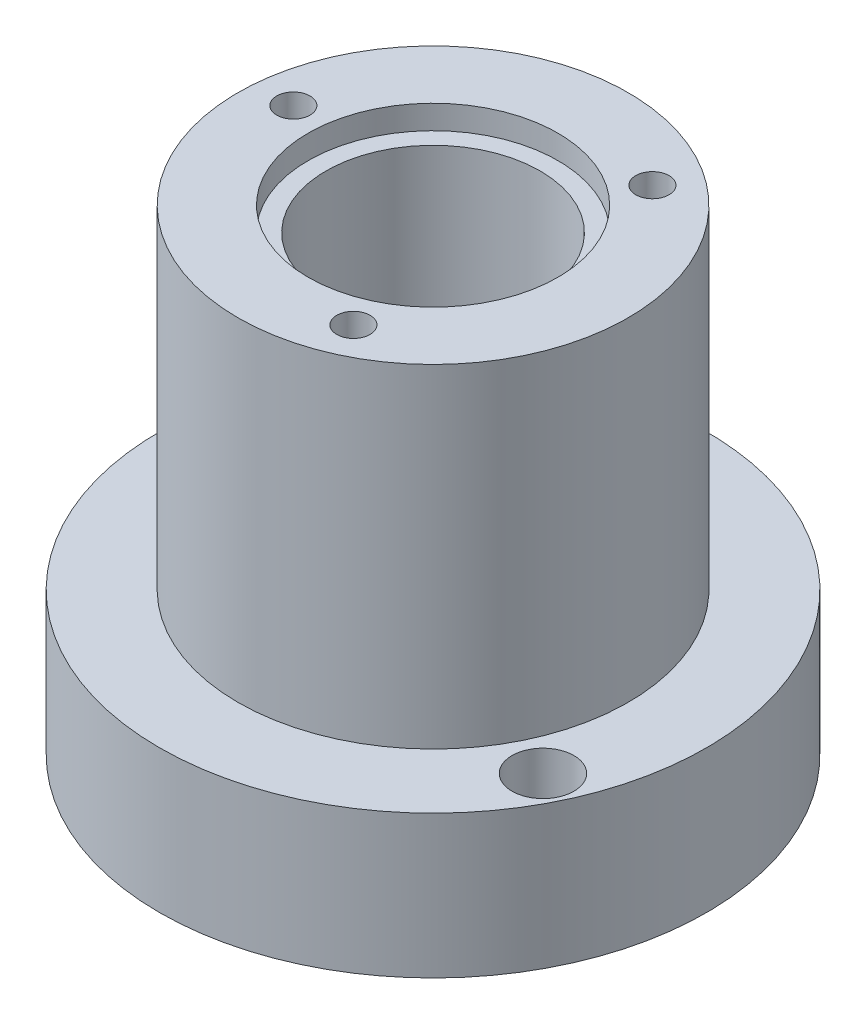
ISO-10303-21;
HEADER;
FILE_DESCRIPTION(('STEP AP214'),'2;1');
FILE_NAME('part.step','',(''),(''),'','','');
FILE_SCHEMA(('AUTOMOTIVE_DESIGN { 1 0 10303 214 1 1 1 1 }'));
ENDSEC;
DATA;
#1=APPLICATION_CONTEXT('core data for automotive mechanical design processes');
#2=APPLICATION_PROTOCOL_DEFINITION('international standard','automotive_design',2000,#1);
#3=PRODUCT_CONTEXT('',#1,'mechanical');
#4=PRODUCT('Part','Part','',(#3));
#5=PRODUCT_RELATED_PRODUCT_CATEGORY('part','',(#4));
#6=PRODUCT_DEFINITION_FORMATION('','',#4);
#7=PRODUCT_DEFINITION_CONTEXT('part definition',#1,'design');
#8=PRODUCT_DEFINITION('design','',#6,#7);
#9=PRODUCT_DEFINITION_SHAPE('','',#8);
#10=(LENGTH_UNIT() NAMED_UNIT(*) SI_UNIT(.MILLI.,.METRE.));
#11=(NAMED_UNIT(*) PLANE_ANGLE_UNIT() SI_UNIT($,.RADIAN.));
#12=(NAMED_UNIT(*) SI_UNIT($,.STERADIAN.) SOLID_ANGLE_UNIT());
#13=UNCERTAINTY_MEASURE_WITH_UNIT(LENGTH_MEASURE(1.E-05),#10,'distance_accuracy_value','');
#14=(GEOMETRIC_REPRESENTATION_CONTEXT(3) GLOBAL_UNCERTAINTY_ASSIGNED_CONTEXT((#13)) GLOBAL_UNIT_ASSIGNED_CONTEXT((#10,
#11,#12)) REPRESENTATION_CONTEXT('',''));
#15=CARTESIAN_POINT('',(0.,0.,0.));
#16=DIRECTION('',(0.,0.,1.));
#17=DIRECTION('',(1.,0.,0.));
#18=AXIS2_PLACEMENT_3D('',#15,#16,#17);
#19=CARTESIAN_POINT('',(13.0281539228037,25.4,14.3830452707903));
#20=DIRECTION('',(0.,-1.,0.));
#21=DIRECTION('',(0.,0.,-1.));
#22=AXIS2_PLACEMENT_3D('',#19,#20,#21);
#23=CYLINDRICAL_SURFACE('',#22,14.605);
#24=CARTESIAN_POINT('',(13.0281539228037,0.,14.3830452707903));
#25=DIRECTION('',(0.,1.,0.));
#26=DIRECTION('',(0.,0.,1.));
#27=AXIS2_PLACEMENT_3D('',#24,#25,#26);
#28=CIRCLE('',#27,14.605);
#29=CARTESIAN_POINT('',(13.0281539228037,0.,28.9880452707903));
#30=VERTEX_POINT('',#29);
#31=EDGE_CURVE('E12',#30,#30,#28,.T.);
#32=ORIENTED_EDGE('',*,*,#31,.T.);
#33=EDGE_LOOP('',(#32));
#34=FACE_BOUND('',#33,.T.);
#35=CARTESIAN_POINT('',(13.0281539228037,7.62,14.3830452707903));
#36=DIRECTION('',(0.,1.,0.));
#37=DIRECTION('',(0.,0.,1.));
#38=AXIS2_PLACEMENT_3D('',#35,#36,#37);
#39=CIRCLE('',#38,14.605);
#40=CARTESIAN_POINT('',(13.0281539228037,7.62,28.9880452707903));
#41=VERTEX_POINT('',#40);
#42=EDGE_CURVE('E138',#41,#41,#39,.T.);
#43=ORIENTED_EDGE('',*,*,#42,.F.);
#44=EDGE_LOOP('',(#43));
#45=FACE_BOUND('',#44,.T.);
#46=ADVANCED_FACE('F39',(#34,#45),#23,.T.);
#47=CARTESIAN_POINT('',(13.0281539228037,25.4,14.3830452707903));
#48=DIRECTION('',(0.,1.,0.));
#49=DIRECTION('',(0.,0.,1.));
#50=AXIS2_PLACEMENT_3D('',#47,#48,#49);
#51=PLANE('',#50);
#52=CARTESIAN_POINT('',(16.4348390463682,25.4,22.0415320971081));
#53=DIRECTION('',(0.,1.,0.));
#54=DIRECTION('',(0.,0.,1.));
#55=AXIS2_PLACEMENT_3D('',#52,#53,#54);
#56=CIRCLE('',#55,0.889000000000001);
#57=CARTESIAN_POINT('',(16.4348390463682,25.4,22.9305320971081));
#58=VERTEX_POINT('',#57);
#59=EDGE_CURVE('E116',#58,#58,#56,.T.);
#60=ORIENTED_EDGE('',*,*,#59,.F.);
#61=EDGE_LOOP('',(#60));
#62=FACE_BOUND('',#61,.T.);
#63=CARTESIAN_POINT('',(17.9572555071611,25.4,7.60352599792991));
#64=DIRECTION('',(0.,1.,0.));
#65=DIRECTION('',(0.,0.,1.));
#66=AXIS2_PLACEMENT_3D('',#63,#64,#65);
#67=CIRCLE('',#66,0.889000000000001);
#68=CARTESIAN_POINT('',(17.9572555071611,25.4,8.49252599792991));
#69=VERTEX_POINT('',#68);
#70=EDGE_CURVE('E122',#69,#69,#67,.T.);
#71=ORIENTED_EDGE('',*,*,#70,.F.);
#72=EDGE_LOOP('',(#71));
#73=FACE_BOUND('',#72,.T.);
#74=CARTESIAN_POINT('',(4.69236721488166,25.4,13.5040777173328));
#75=DIRECTION('',(0.,1.,0.));
#76=DIRECTION('',(0.,0.,1.));
#77=AXIS2_PLACEMENT_3D('',#74,#75,#76);
#78=CIRCLE('',#77,0.889);
#79=CARTESIAN_POINT('',(4.69236721488166,25.4,14.3930777173328));
#80=VERTEX_POINT('',#79);
#81=EDGE_CURVE('E128',#80,#80,#78,.T.);
#82=ORIENTED_EDGE('',*,*,#81,.F.);
#83=EDGE_LOOP('',(#82));
#84=FACE_BOUND('',#83,.T.);
#85=CARTESIAN_POINT('',(13.0281539228037,25.4,14.3830452707903));
#86=DIRECTION('',(0.,1.,0.));
#87=DIRECTION('',(0.,0.,1.));
#88=AXIS2_PLACEMENT_3D('',#85,#86,#87);
#89=CIRCLE('',#88,6.6675);
#90=CARTESIAN_POINT('',(13.0281539228037,25.4,21.0505452707903));
#91=VERTEX_POINT('',#90);
#92=EDGE_CURVE('E145',#91,#91,#89,.T.);
#93=ORIENTED_EDGE('',*,*,#92,.F.);
#94=EDGE_LOOP('',(#93));
#95=FACE_BOUND('',#94,.T.);
#96=CARTESIAN_POINT('',(13.0281539228037,25.4,14.3830452707903));
#97=DIRECTION('',(0.,1.,0.));
#98=DIRECTION('',(0.,0.,1.));
#99=AXIS2_PLACEMENT_3D('',#96,#97,#98);
#100=CIRCLE('',#99,10.414);
#101=CARTESIAN_POINT('',(13.0281539228037,25.4,24.7970452707903));
#102=VERTEX_POINT('',#101);
#103=EDGE_CURVE('E134',#102,#102,#100,.T.);
#104=ORIENTED_EDGE('',*,*,#103,.T.);
#105=EDGE_LOOP('',(#104));
#106=FACE_BOUND('',#105,.T.);
#107=ADVANCED_FACE('F171',(#62,#73,#84,#95,#106),#51,.T.);
#108=CARTESIAN_POINT('',(13.0281539228037,0.,14.3830452707903));
#109=DIRECTION('',(0.,1.,0.));
#110=DIRECTION('',(0.,0.,1.));
#111=AXIS2_PLACEMENT_3D('',#108,#109,#110);
#112=CYLINDRICAL_SURFACE('',#111,5.715);
#113=CARTESIAN_POINT('',(13.0281539228037,0.,14.3830452707903));
#114=DIRECTION('',(0.,1.,0.));
#115=DIRECTION('',(0.,0.,1.));
#116=AXIS2_PLACEMENT_3D('',#113,#114,#115);
#117=CIRCLE('',#116,5.715);
#118=CARTESIAN_POINT('',(13.0281539228037,0.,20.0980452707903));
#119=VERTEX_POINT('',#118);
#120=EDGE_CURVE('E47',#119,#119,#117,.T.);
#121=ORIENTED_EDGE('',*,*,#120,.F.);
#122=EDGE_LOOP('',(#121));
#123=FACE_BOUND('',#122,.T.);
#124=CARTESIAN_POINT('',(13.0281539228037,24.13,14.3830452707903));
#125=DIRECTION('',(0.,1.,0.));
#126=DIRECTION('',(0.,0.,1.));
#127=AXIS2_PLACEMENT_3D('',#124,#125,#126);
#128=CIRCLE('',#127,5.715);
#129=CARTESIAN_POINT('',(13.0281539228037,24.13,20.0980452707903));
#130=VERTEX_POINT('',#129);
#131=EDGE_CURVE('E144',#130,#130,#128,.F.);
#132=ORIENTED_EDGE('',*,*,#131,.F.);
#133=EDGE_LOOP('',(#132));
#134=FACE_BOUND('',#133,.T.);
#135=ADVANCED_FACE('F176',(#123,#134),#112,.F.);
#136=CARTESIAN_POINT('',(13.0281539228037,0.,14.3830452707903));
#137=DIRECTION('',(0.,1.,0.));
#138=DIRECTION('',(0.,0.,1.));
#139=AXIS2_PLACEMENT_3D('',#136,#137,#138);
#140=PLANE('',#139);
#141=CARTESIAN_POINT('',(5.82740256425499,0.,15.2376598659039));
#142=DIRECTION('',(0.,-1.,0.));
#143=DIRECTION('',(0.,0.,-1.));
#144=AXIS2_PLACEMENT_3D('',#141,#142,#143);
#145=CIRCLE('',#144,0.595629999999989);
#146=CARTESIAN_POINT('',(5.82740256425499,0.,14.6420298659039));
#147=VERTEX_POINT('',#146);
#148=EDGE_CURVE('E81',#147,#147,#145,.T.);
#149=ORIENTED_EDGE('',*,*,#148,.F.);
#150=EDGE_LOOP('',(#149));
#151=FACE_BOUND('',#150,.T.);
#152=CARTESIAN_POINT('',(5.82740256425499,0.,19.0476598659039));
#153=DIRECTION('',(0.,-1.,0.));
#154=DIRECTION('',(0.,0.,-1.));
#155=AXIS2_PLACEMENT_3D('',#152,#153,#154);
#156=CIRCLE('',#155,0.595629999999989);
#157=CARTESIAN_POINT('',(5.82740256425499,0.,18.4520298659039));
#158=VERTEX_POINT('',#157);
#159=EDGE_CURVE('E80',#158,#158,#156,.T.);
#160=ORIENTED_EDGE('',*,*,#159,.F.);
#161=EDGE_LOOP('',(#160));
#162=FACE_BOUND('',#161,.T.);
#163=CARTESIAN_POINT('',(5.82740256425499,0.,17.1426598659039));
#164=DIRECTION('',(0.,-1.,0.));
#165=DIRECTION('',(0.,0.,-1.));
#166=AXIS2_PLACEMENT_3D('',#163,#164,#165);
#167=CIRCLE('',#166,0.79375);
#168=CARTESIAN_POINT('',(5.82740256425499,0.,16.3489098659039));
#169=VERTEX_POINT('',#168);
#170=EDGE_CURVE('E91',#169,#169,#167,.T.);
#171=ORIENTED_EDGE('',*,*,#170,.F.);
#172=EDGE_LOOP('',(#171));
#173=FACE_BOUND('',#172,.T.);
#174=CARTESIAN_POINT('',(24.4495533797354,0.,19.9365697773716));
#175=DIRECTION('',(0.,-1.,0.));
#176=DIRECTION('',(0.,0.,1.));
#177=AXIS2_PLACEMENT_3D('',#174,#175,#176);
#178=CIRCLE('',#177,1.651);
#179=CARTESIAN_POINT('',(24.4495533797354,0.,18.2855697773716));
#180=VERTEX_POINT('',#179);
#181=EDGE_CURVE('E95',#180,#180,#178,.T.);
#182=ORIENTED_EDGE('',*,*,#181,.F.);
#183=EDGE_LOOP('',(#182));
#184=FACE_BOUND('',#183,.T.);
#185=CARTESIAN_POINT('',(1.60675446587194,0.,8.82952076420888));
#186=DIRECTION('',(0.,-1.,0.));
#187=DIRECTION('',(0.,0.,-1.));
#188=AXIS2_PLACEMENT_3D('',#185,#186,#187);
#189=CIRCLE('',#188,1.651);
#190=CARTESIAN_POINT('',(1.60675446587194,0.,7.17852076420888));
#191=VERTEX_POINT('',#190);
#192=EDGE_CURVE('E100',#191,#191,#189,.T.);
#193=ORIENTED_EDGE('',*,*,#192,.F.);
#194=EDGE_LOOP('',(#193));
#195=FACE_BOUND('',#194,.T.);
#196=CARTESIAN_POINT('',(17.8930413905689,0.,4.37789934651808));
#197=DIRECTION('',(0.,-1.,0.));
#198=DIRECTION('',(0.,0.,-1.));
#199=AXIS2_PLACEMENT_3D('',#196,#197,#198);
#200=CIRCLE('',#199,0.793749999999999);
#201=CARTESIAN_POINT('',(17.8930413905689,0.,3.58414934651808));
#202=VERTEX_POINT('',#201);
#203=EDGE_CURVE('E104',#202,#202,#200,.T.);
#204=ORIENTED_EDGE('',*,*,#203,.F.);
#205=EDGE_LOOP('',(#204));
#206=FACE_BOUND('',#205,.T.);
#207=CARTESIAN_POINT('',(8.16326645503836,0.,24.3881911950625));
#208=DIRECTION('',(0.,-1.,0.));
#209=DIRECTION('',(0.,0.,-1.));
#210=AXIS2_PLACEMENT_3D('',#207,#208,#209);
#211=CIRCLE('',#210,0.793749999999999);
#212=CARTESIAN_POINT('',(8.16326645503836,0.,23.5944411950625));
#213=VERTEX_POINT('',#212);
#214=EDGE_CURVE('E110',#213,#213,#211,.T.);
#215=ORIENTED_EDGE('',*,*,#214,.F.);
#216=EDGE_LOOP('',(#215));
#217=FACE_BOUND('',#216,.T.);
#218=ORIENTED_EDGE('',*,*,#120,.T.);
#219=EDGE_LOOP('',(#218));
#220=FACE_BOUND('',#219,.T.);
#221=ORIENTED_EDGE('',*,*,#31,.F.);
#222=EDGE_LOOP('',(#221));
#223=FACE_BOUND('',#222,.T.);
#224=ADVANCED_FACE('F181',(#151,#162,#173,#184,#195,#206,#217,#220,#223),#140,.F.);
#225=CARTESIAN_POINT('',(13.0281539228037,24.13,14.3830452707903));
#226=DIRECTION('',(0.,1.,0.));
#227=DIRECTION('',(0.,0.,1.));
#228=AXIS2_PLACEMENT_3D('',#225,#226,#227);
#229=PLANE('',#228);
#230=CARTESIAN_POINT('',(13.0281539228037,24.13,14.3830452707903));
#231=DIRECTION('',(0.,1.,0.));
#232=DIRECTION('',(0.,0.,1.));
#233=AXIS2_PLACEMENT_3D('',#230,#231,#232);
#234=CIRCLE('',#233,6.6675);
#235=CARTESIAN_POINT('',(13.0281539228037,24.13,21.0505452707903));
#236=VERTEX_POINT('',#235);
#237=EDGE_CURVE('E141',#236,#236,#234,.T.);
#238=ORIENTED_EDGE('',*,*,#237,.T.);
#239=EDGE_LOOP('',(#238));
#240=FACE_BOUND('',#239,.T.);
#241=ORIENTED_EDGE('',*,*,#131,.T.);
#242=EDGE_LOOP('',(#241));
#243=FACE_BOUND('',#242,.T.);
#244=ADVANCED_FACE('F183',(#240,#243),#229,.T.);
#245=CARTESIAN_POINT('',(13.0281539228037,24.13,14.3830452707903));
#246=DIRECTION('',(0.,1.,0.));
#247=DIRECTION('',(0.,0.,1.));
#248=AXIS2_PLACEMENT_3D('',#245,#246,#247);
#249=CYLINDRICAL_SURFACE('',#248,6.6675);
#250=ORIENTED_EDGE('',*,*,#237,.F.);
#251=EDGE_LOOP('',(#250));
#252=FACE_BOUND('',#251,.T.);
#253=ORIENTED_EDGE('',*,*,#92,.T.);
#254=EDGE_LOOP('',(#253));
#255=FACE_BOUND('',#254,.T.);
#256=ADVANCED_FACE('F163',(#252,#255),#249,.F.);
#257=CARTESIAN_POINT('',(13.0281539228037,7.62,14.3830452707903));
#258=DIRECTION('',(0.,1.,0.));
#259=DIRECTION('',(0.,0.,1.));
#260=AXIS2_PLACEMENT_3D('',#257,#258,#259);
#261=PLANE('',#260);
#262=CARTESIAN_POINT('',(24.4495533797354,7.62,19.9365697773716));
#263=DIRECTION('',(0.,1.,0.));
#264=DIRECTION('',(0.,0.,1.));
#265=AXIS2_PLACEMENT_3D('',#262,#263,#264);
#266=CIRCLE('',#265,1.651);
#267=CARTESIAN_POINT('',(24.4495533797354,7.62,18.2855697773716));
#268=VERTEX_POINT('',#267);
#269=EDGE_CURVE('E42',#268,#268,#266,.T.);
#270=ORIENTED_EDGE('',*,*,#269,.F.);
#271=EDGE_LOOP('',(#270));
#272=FACE_BOUND('',#271,.T.);
#273=CARTESIAN_POINT('',(1.60675446587194,7.62,8.82952076420888));
#274=DIRECTION('',(0.,1.,0.));
#275=DIRECTION('',(0.,0.,1.));
#276=AXIS2_PLACEMENT_3D('',#273,#274,#275);
#277=CIRCLE('',#276,1.651);
#278=CARTESIAN_POINT('',(1.60675446587194,7.62,7.17852076420888));
#279=VERTEX_POINT('',#278);
#280=EDGE_CURVE('E103',#279,#279,#277,.T.);
#281=ORIENTED_EDGE('',*,*,#280,.F.);
#282=EDGE_LOOP('',(#281));
#283=FACE_BOUND('',#282,.T.);
#284=CARTESIAN_POINT('',(13.0281539228037,7.62,14.3830452707903));
#285=DIRECTION('',(0.,1.,0.));
#286=DIRECTION('',(0.,0.,1.));
#287=AXIS2_PLACEMENT_3D('',#284,#285,#286);
#288=CIRCLE('',#287,10.414);
#289=CARTESIAN_POINT('',(13.0281539228037,7.62,24.7970452707903));
#290=VERTEX_POINT('',#289);
#291=EDGE_CURVE('E135',#290,#290,#288,.T.);
#292=ORIENTED_EDGE('',*,*,#291,.F.);
#293=EDGE_LOOP('',(#292));
#294=FACE_BOUND('',#293,.T.);
#295=ORIENTED_EDGE('',*,*,#42,.T.);
#296=EDGE_LOOP('',(#295));
#297=FACE_BOUND('',#296,.T.);
#298=ADVANCED_FACE('F159',(#272,#283,#294,#297),#261,.T.);
#299=CARTESIAN_POINT('',(13.0281539228037,7.62,14.3830452707903));
#300=DIRECTION('',(0.,1.,0.));
#301=DIRECTION('',(0.,0.,1.));
#302=AXIS2_PLACEMENT_3D('',#299,#300,#301);
#303=CYLINDRICAL_SURFACE('',#302,10.414);
#304=ORIENTED_EDGE('',*,*,#291,.T.);
#305=EDGE_LOOP('',(#304));
#306=FACE_BOUND('',#305,.T.);
#307=ORIENTED_EDGE('',*,*,#103,.F.);
#308=EDGE_LOOP('',(#307));
#309=FACE_BOUND('',#308,.T.);
#310=ADVANCED_FACE('F162',(#306,#309),#303,.T.);
#311=CARTESIAN_POINT('',(4.69236721488166,22.86,13.5040777173328));
#312=DIRECTION('',(0.,1.,0.));
#313=DIRECTION('',(0.,0.,1.));
#314=AXIS2_PLACEMENT_3D('',#311,#312,#313);
#315=CONICAL_SURFACE('',#314,0.888999999999999,1.02974425867665);
#316=CARTESIAN_POINT('',(4.69236721488166,22.3258349096845,13.5040777173328));
#317=VERTEX_POINT('',#316);
#318=VERTEX_LOOP('',#317);
#319=FACE_BOUND('',#318,.T.);
#320=CARTESIAN_POINT('',(4.69236721488166,22.86,13.5040777173328));
#321=DIRECTION('',(0.,1.,0.));
#322=DIRECTION('',(0.,0.,1.));
#323=AXIS2_PLACEMENT_3D('',#320,#321,#322);
#324=CIRCLE('',#323,0.888999999999999);
#325=CARTESIAN_POINT('',(4.69236721488166,22.86,14.3930777173328));
#326=VERTEX_POINT('',#325);
#327=EDGE_CURVE('E131',#326,#326,#324,.T.);
#328=ORIENTED_EDGE('',*,*,#327,.T.);
#329=EDGE_LOOP('',(#328));
#330=FACE_BOUND('',#329,.T.);
#331=ADVANCED_FACE('F201',(#319,#330),#315,.F.);
#332=CARTESIAN_POINT('',(4.69236721488166,25.4,13.5040777173328));
#333=DIRECTION('',(0.,1.,0.));
#334=DIRECTION('',(0.,0.,1.));
#335=AXIS2_PLACEMENT_3D('',#332,#333,#334);
#336=CYLINDRICAL_SURFACE('',#335,0.889);
#337=ORIENTED_EDGE('',*,*,#327,.F.);
#338=EDGE_LOOP('',(#337));
#339=FACE_BOUND('',#338,.T.);
#340=ORIENTED_EDGE('',*,*,#81,.T.);
#341=EDGE_LOOP('',(#340));
#342=FACE_BOUND('',#341,.T.);
#343=ADVANCED_FACE('F205',(#339,#342),#336,.F.);
#344=CARTESIAN_POINT('',(17.9572555071611,22.86,7.60352599792991));
#345=DIRECTION('',(0.,1.,0.));
#346=DIRECTION('',(0.,0.,1.));
#347=AXIS2_PLACEMENT_3D('',#344,#345,#346);
#348=CONICAL_SURFACE('',#347,0.889000000000001,1.02974425867665);
#349=CARTESIAN_POINT('',(17.9572555071611,22.3258349096845,7.60352599792991));
#350=VERTEX_POINT('',#349);
#351=VERTEX_LOOP('',#350);
#352=FACE_BOUND('',#351,.T.);
#353=CARTESIAN_POINT('',(17.9572555071611,22.86,7.60352599792991));
#354=DIRECTION('',(0.,1.,0.));
#355=DIRECTION('',(0.,0.,1.));
#356=AXIS2_PLACEMENT_3D('',#353,#354,#355);
#357=CIRCLE('',#356,0.889000000000001);
#358=CARTESIAN_POINT('',(17.9572555071611,22.86,8.49252599792991));
#359=VERTEX_POINT('',#358);
#360=EDGE_CURVE('E125',#359,#359,#357,.T.);
#361=ORIENTED_EDGE('',*,*,#360,.T.);
#362=EDGE_LOOP('',(#361));
#363=FACE_BOUND('',#362,.T.);
#364=ADVANCED_FACE('F208',(#352,#363),#348,.F.);
#365=CARTESIAN_POINT('',(17.9572555071611,25.4,7.60352599792991));
#366=DIRECTION('',(0.,1.,0.));
#367=DIRECTION('',(0.,0.,1.));
#368=AXIS2_PLACEMENT_3D('',#365,#366,#367);
#369=CYLINDRICAL_SURFACE('',#368,0.889000000000001);
#370=ORIENTED_EDGE('',*,*,#360,.F.);
#371=EDGE_LOOP('',(#370));
#372=FACE_BOUND('',#371,.T.);
#373=ORIENTED_EDGE('',*,*,#70,.T.);
#374=EDGE_LOOP('',(#373));
#375=FACE_BOUND('',#374,.T.);
#376=ADVANCED_FACE('F212',(#372,#375),#369,.F.);
#377=CARTESIAN_POINT('',(16.4348390463682,22.86,22.0415320971081));
#378=DIRECTION('',(0.,1.,0.));
#379=DIRECTION('',(0.,0.,1.));
#380=AXIS2_PLACEMENT_3D('',#377,#378,#379);
#381=CONICAL_SURFACE('',#380,0.889000000000001,1.02974425867665);
#382=CARTESIAN_POINT('',(16.4348390463682,22.3258349096845,22.0415320971081));
#383=VERTEX_POINT('',#382);
#384=VERTEX_LOOP('',#383);
#385=FACE_BOUND('',#384,.T.);
#386=CARTESIAN_POINT('',(16.4348390463682,22.86,22.0415320971081));
#387=DIRECTION('',(0.,1.,0.));
#388=DIRECTION('',(0.,0.,1.));
#389=AXIS2_PLACEMENT_3D('',#386,#387,#388);
#390=CIRCLE('',#389,0.889000000000001);
#391=CARTESIAN_POINT('',(16.4348390463682,22.86,22.9305320971081));
#392=VERTEX_POINT('',#391);
#393=EDGE_CURVE('E119',#392,#392,#390,.T.);
#394=ORIENTED_EDGE('',*,*,#393,.T.);
#395=EDGE_LOOP('',(#394));
#396=FACE_BOUND('',#395,.T.);
#397=ADVANCED_FACE('F215',(#385,#396),#381,.F.);
#398=CARTESIAN_POINT('',(16.4348390463682,25.4,22.0415320971081));
#399=DIRECTION('',(0.,1.,0.));
#400=DIRECTION('',(0.,0.,1.));
#401=AXIS2_PLACEMENT_3D('',#398,#399,#400);
#402=CYLINDRICAL_SURFACE('',#401,0.889000000000001);
#403=ORIENTED_EDGE('',*,*,#393,.F.);
#404=EDGE_LOOP('',(#403));
#405=FACE_BOUND('',#404,.T.);
#406=ORIENTED_EDGE('',*,*,#59,.T.);
#407=EDGE_LOOP('',(#406));
#408=FACE_BOUND('',#407,.T.);
#409=ADVANCED_FACE('F219',(#405,#408),#402,.F.);
#410=CARTESIAN_POINT('',(8.16326645503836,4.0005,24.3881911950625));
#411=DIRECTION('',(0.,-1.,0.));
#412=DIRECTION('',(0.,0.,-1.));
#413=AXIS2_PLACEMENT_3D('',#410,#411,#412);
#414=CONICAL_SURFACE('',#413,0.793749999999999,1.02974425867665);
#415=CARTESIAN_POINT('',(8.16326645503836,4.47743311635313,24.3881911950625));
#416=VERTEX_POINT('',#415);
#417=VERTEX_LOOP('',#416);
#418=FACE_BOUND('',#417,.T.);
#419=CARTESIAN_POINT('',(8.16326645503836,4.0005,24.3881911950625));
#420=DIRECTION('',(0.,-1.,0.));
#421=DIRECTION('',(0.,0.,-1.));
#422=AXIS2_PLACEMENT_3D('',#419,#420,#421);
#423=CIRCLE('',#422,0.793749999999999);
#424=CARTESIAN_POINT('',(8.16326645503836,4.0005,23.5944411950625));
#425=VERTEX_POINT('',#424);
#426=EDGE_CURVE('E113',#425,#425,#423,.T.);
#427=ORIENTED_EDGE('',*,*,#426,.T.);
#428=EDGE_LOOP('',(#427));
#429=FACE_BOUND('',#428,.T.);
#430=ADVANCED_FACE('F223',(#418,#429),#414,.F.);
#431=CARTESIAN_POINT('',(8.16326645503836,0.,24.3881911950625));
#432=DIRECTION('',(0.,-1.,0.));
#433=DIRECTION('',(0.,0.,-1.));
#434=AXIS2_PLACEMENT_3D('',#431,#432,#433);
#435=CYLINDRICAL_SURFACE('',#434,0.793749999999999);
#436=ORIENTED_EDGE('',*,*,#426,.F.);
#437=EDGE_LOOP('',(#436));
#438=FACE_BOUND('',#437,.T.);
#439=ORIENTED_EDGE('',*,*,#214,.T.);
#440=EDGE_LOOP('',(#439));
#441=FACE_BOUND('',#440,.T.);
#442=ADVANCED_FACE('F227',(#438,#441),#435,.F.);
#443=CARTESIAN_POINT('',(17.8930413905689,4.0005,4.37789934651808));
#444=DIRECTION('',(0.,-1.,0.));
#445=DIRECTION('',(0.,0.,-1.));
#446=AXIS2_PLACEMENT_3D('',#443,#444,#445);
#447=CONICAL_SURFACE('',#446,0.793749999999999,1.02974425867665);
#448=CARTESIAN_POINT('',(17.8930413905689,4.47743311635313,4.37789934651808));
#449=VERTEX_POINT('',#448);
#450=VERTEX_LOOP('',#449);
#451=FACE_BOUND('',#450,.T.);
#452=CARTESIAN_POINT('',(17.8930413905689,4.0005,4.37789934651808));
#453=DIRECTION('',(0.,-1.,0.));
#454=DIRECTION('',(0.,0.,-1.));
#455=AXIS2_PLACEMENT_3D('',#452,#453,#454);
#456=CIRCLE('',#455,0.793749999999999);
#457=CARTESIAN_POINT('',(17.8930413905689,4.0005,3.58414934651808));
#458=VERTEX_POINT('',#457);
#459=EDGE_CURVE('E107',#458,#458,#456,.T.);
#460=ORIENTED_EDGE('',*,*,#459,.T.);
#461=EDGE_LOOP('',(#460));
#462=FACE_BOUND('',#461,.T.);
#463=ADVANCED_FACE('F231',(#451,#462),#447,.F.);
#464=CARTESIAN_POINT('',(17.8930413905689,0.,4.37789934651808));
#465=DIRECTION('',(0.,-1.,0.));
#466=DIRECTION('',(0.,0.,-1.));
#467=AXIS2_PLACEMENT_3D('',#464,#465,#466);
#468=CYLINDRICAL_SURFACE('',#467,0.793749999999999);
#469=ORIENTED_EDGE('',*,*,#459,.F.);
#470=EDGE_LOOP('',(#469));
#471=FACE_BOUND('',#470,.T.);
#472=ORIENTED_EDGE('',*,*,#203,.T.);
#473=EDGE_LOOP('',(#472));
#474=FACE_BOUND('',#473,.T.);
#475=ADVANCED_FACE('F235',(#471,#474),#468,.F.);
#476=CARTESIAN_POINT('',(1.60675446587194,8.89,8.82952076420888));
#477=DIRECTION('',(0.,-1.,0.));
#478=DIRECTION('',(0.,0.,-1.));
#479=AXIS2_PLACEMENT_3D('',#476,#477,#478);
#480=CYLINDRICAL_SURFACE('',#479,1.651);
#481=CARTESIAN_POINT('',(1.60675446587194,7.62,7.17852076420888));
#482=CARTESIAN_POINT('',(1.60675446587194,7.540625,7.17852076420888));
#483=CARTESIAN_POINT('',(1.60675446587194,7.46125,7.17852076420888));
#484=CARTESIAN_POINT('',(1.60675446587194,7.3025,7.17852076420888));
#485=CARTESIAN_POINT('',(1.60675446587194,7.223125,7.17852076420888));
#486=CARTESIAN_POINT('',(1.60675446587194,7.064375,7.17852076420888));
#487=CARTESIAN_POINT('',(1.60675446587194,6.985,7.17852076420888));
#488=CARTESIAN_POINT('',(1.60675446587194,6.82625,7.17852076420888));
#489=CARTESIAN_POINT('',(1.60675446587194,6.746875,7.17852076420888));
#490=CARTESIAN_POINT('',(1.60675446587194,6.588125,7.17852076420888));
#491=CARTESIAN_POINT('',(1.60675446587194,6.50875,7.17852076420888));
#492=CARTESIAN_POINT('',(1.60675446587194,6.35,7.17852076420888));
#493=CARTESIAN_POINT('',(1.60675446587194,6.270625,7.17852076420888));
#494=CARTESIAN_POINT('',(1.60675446587194,6.111875,7.17852076420888));
#495=CARTESIAN_POINT('',(1.60675446587194,6.0325,7.17852076420888));
#496=CARTESIAN_POINT('',(1.60675446587194,5.87375,7.17852076420888));
#497=CARTESIAN_POINT('',(1.60675446587194,5.794375,7.17852076420888));
#498=CARTESIAN_POINT('',(1.60675446587194,5.635625,7.17852076420888));
#499=CARTESIAN_POINT('',(1.60675446587194,5.55625,7.17852076420888));
#500=CARTESIAN_POINT('',(1.60675446587194,5.3975,7.17852076420888));
#501=CARTESIAN_POINT('',(1.60675446587194,5.318125,7.17852076420888));
#502=CARTESIAN_POINT('',(1.60675446587194,5.159375,7.17852076420888));
#503=CARTESIAN_POINT('',(1.60675446587194,5.08,7.17852076420888));
#504=CARTESIAN_POINT('',(1.60675446587194,4.92125,7.17852076420888));
#505=CARTESIAN_POINT('',(1.60675446587194,4.841875,7.17852076420888));
#506=CARTESIAN_POINT('',(1.60675446587194,4.683125,7.17852076420888));
#507=CARTESIAN_POINT('',(1.60675446587194,4.60375,7.17852076420888));
#508=CARTESIAN_POINT('',(1.60675446587194,4.445,7.17852076420888));
#509=CARTESIAN_POINT('',(1.60675446587194,4.365625,7.17852076420888));
#510=CARTESIAN_POINT('',(1.60675446587194,4.206875,7.17852076420888));
#511=CARTESIAN_POINT('',(1.60675446587194,4.1275,7.17852076420888));
#512=CARTESIAN_POINT('',(1.60675446587194,3.96875,7.17852076420888));
#513=CARTESIAN_POINT('',(1.60675446587194,3.889375,7.17852076420888));
#514=CARTESIAN_POINT('',(1.60675446587194,3.730625,7.17852076420888));
#515=CARTESIAN_POINT('',(1.60675446587194,3.65125,7.17852076420888));
#516=CARTESIAN_POINT('',(1.60675446587194,3.4925,7.17852076420888));
#517=CARTESIAN_POINT('',(1.60675446587194,3.413125,7.17852076420888));
#518=CARTESIAN_POINT('',(1.60675446587194,3.254375,7.17852076420888));
#519=CARTESIAN_POINT('',(1.60675446587194,3.175,7.17852076420888));
#520=CARTESIAN_POINT('',(1.60675446587194,3.01625,7.17852076420888));
#521=CARTESIAN_POINT('',(1.60675446587194,2.936875,7.17852076420888));
#522=CARTESIAN_POINT('',(1.60675446587194,2.778125,7.17852076420888));
#523=CARTESIAN_POINT('',(1.60675446587194,2.69875,7.17852076420888));
#524=CARTESIAN_POINT('',(1.60675446587194,2.54,7.17852076420888));
#525=CARTESIAN_POINT('',(1.60675446587194,2.460625,7.17852076420888));
#526=CARTESIAN_POINT('',(1.60675446587194,2.301875,7.17852076420888));
#527=CARTESIAN_POINT('',(1.60675446587194,2.2225,7.17852076420888));
#528=CARTESIAN_POINT('',(1.60675446587194,2.06375,7.17852076420888));
#529=CARTESIAN_POINT('',(1.60675446587194,1.984375,7.17852076420888));
#530=CARTESIAN_POINT('',(1.60675446587194,1.825625,7.17852076420888));
#531=CARTESIAN_POINT('',(1.60675446587194,1.74625,7.17852076420888));
#532=CARTESIAN_POINT('',(1.60675446587194,1.5875,7.17852076420888));
#533=CARTESIAN_POINT('',(1.60675446587194,1.508125,7.17852076420888));
#534=CARTESIAN_POINT('',(1.60675446587194,1.349375,7.17852076420888));
#535=CARTESIAN_POINT('',(1.60675446587194,1.27,7.17852076420888));
#536=CARTESIAN_POINT('',(1.60675446587194,1.11125,7.17852076420888));
#537=CARTESIAN_POINT('',(1.60675446587194,1.031875,7.17852076420888));
#538=CARTESIAN_POINT('',(1.60675446587194,0.873125,7.17852076420888));
#539=CARTESIAN_POINT('',(1.60675446587194,0.79375,7.17852076420888));
#540=CARTESIAN_POINT('',(1.60675446587194,0.635,7.17852076420888));
#541=CARTESIAN_POINT('',(1.60675446587194,0.555625000000001,7.17852076420888));
#542=CARTESIAN_POINT('',(1.60675446587194,0.396875000000001,7.17852076420888));
#543=CARTESIAN_POINT('',(1.60675446587194,0.317500000000001,7.17852076420888));
#544=CARTESIAN_POINT('',(1.60675446587194,0.15875,7.17852076420888));
#545=CARTESIAN_POINT('',(1.60675446587194,0.0793750000000001,7.17852076420888));
#546=CARTESIAN_POINT('',(1.60675446587194,0.,7.17852076420888));
#547=B_SPLINE_CURVE_WITH_KNOTS('',3,(#481,#482,#483,#484,#485,#486,#487,#488,#489,#490,#491,
#492,#493,#494,#495,#496,#497,#498,#499,#500,#501,#502,#503,#504,#505,#506,#507,#508,#509,#510,
#511,#512,#513,#514,#515,#516,#517,#518,#519,#520,#521,#522,#523,#524,#525,#526,#527,#528,#529,
#530,#531,#532,#533,#534,#535,#536,#537,#538,#539,#540,#541,#542,#543,#544,#545,#546),
.UNSPECIFIED.,.F.,.F.,(4,2,2,2,2,2,2,2,2,2,2,2,2,2,2,2,2,2,2,2,2,2,2,2,2,2,2,2,2,2,2,2,4),(0.,
0.238125,0.47625,0.714375,0.952499999999999,1.190625,1.42875,1.666875,1.905,2.143125,2.38125,
2.619375,2.8575,3.095625,3.33375,3.571875,3.81,4.048125,4.28625,4.524375,4.7625,5.000625,
5.23875,5.476875,5.715,5.953125,6.19125,6.429375,6.6675,6.905625,7.14375,7.381875,7.62),.UNSPECIFIED.);
#548=EDGE_CURVE('BSEAM156',#279,#191,#547,.T.);
#549=ORIENTED_EDGE('',*,*,#280,.T.);
#550=ORIENTED_EDGE('',*,*,#192,.T.);
#551=ORIENTED_EDGE('',*,*,#548,.T.);
#552=ORIENTED_EDGE('',*,*,#548,.F.);
#553=EDGE_LOOP('',(#549,#551,#550,#552));
#554=FACE_BOUND('',#553,.T.);
#555=ADVANCED_FACE('F156',(#554),#480,.F.);
#556=CARTESIAN_POINT('',(24.4495533797354,8.89,19.9365697773716));
#557=DIRECTION('',(0.,-1.,0.));
#558=DIRECTION('',(0.,0.,-1.));
#559=AXIS2_PLACEMENT_3D('',#556,#557,#558);
#560=CYLINDRICAL_SURFACE('',#559,1.651);
#561=CARTESIAN_POINT('',(24.4495533797354,7.62,18.2855697773716));
#562=CARTESIAN_POINT('',(24.4495533797354,7.540625,18.2855697773716));
#563=CARTESIAN_POINT('',(24.4495533797354,7.46125,18.2855697773716));
#564=CARTESIAN_POINT('',(24.4495533797354,7.3025,18.2855697773716));
#565=CARTESIAN_POINT('',(24.4495533797354,7.223125,18.2855697773716));
#566=CARTESIAN_POINT('',(24.4495533797354,7.064375,18.2855697773716));
#567=CARTESIAN_POINT('',(24.4495533797354,6.985,18.2855697773716));
#568=CARTESIAN_POINT('',(24.4495533797354,6.82625,18.2855697773716));
#569=CARTESIAN_POINT('',(24.4495533797354,6.746875,18.2855697773716));
#570=CARTESIAN_POINT('',(24.4495533797354,6.588125,18.2855697773716));
#571=CARTESIAN_POINT('',(24.4495533797354,6.50875,18.2855697773716));
#572=CARTESIAN_POINT('',(24.4495533797354,6.35,18.2855697773716));
#573=CARTESIAN_POINT('',(24.4495533797354,6.270625,18.2855697773716));
#574=CARTESIAN_POINT('',(24.4495533797354,6.111875,18.2855697773716));
#575=CARTESIAN_POINT('',(24.4495533797354,6.0325,18.2855697773716));
#576=CARTESIAN_POINT('',(24.4495533797354,5.87375,18.2855697773716));
#577=CARTESIAN_POINT('',(24.4495533797354,5.794375,18.2855697773716));
#578=CARTESIAN_POINT('',(24.4495533797354,5.635625,18.2855697773716));
#579=CARTESIAN_POINT('',(24.4495533797354,5.55625,18.2855697773716));
#580=CARTESIAN_POINT('',(24.4495533797354,5.3975,18.2855697773716));
#581=CARTESIAN_POINT('',(24.4495533797354,5.318125,18.2855697773716));
#582=CARTESIAN_POINT('',(24.4495533797354,5.159375,18.2855697773716));
#583=CARTESIAN_POINT('',(24.4495533797354,5.08,18.2855697773716));
#584=CARTESIAN_POINT('',(24.4495533797354,4.92125,18.2855697773716));
#585=CARTESIAN_POINT('',(24.4495533797354,4.841875,18.2855697773716));
#586=CARTESIAN_POINT('',(24.4495533797354,4.683125,18.2855697773716));
#587=CARTESIAN_POINT('',(24.4495533797354,4.60375,18.2855697773716));
#588=CARTESIAN_POINT('',(24.4495533797354,4.445,18.2855697773716));
#589=CARTESIAN_POINT('',(24.4495533797354,4.365625,18.2855697773716));
#590=CARTESIAN_POINT('',(24.4495533797354,4.206875,18.2855697773716));
#591=CARTESIAN_POINT('',(24.4495533797354,4.1275,18.2855697773716));
#592=CARTESIAN_POINT('',(24.4495533797354,3.96875,18.2855697773716));
#593=CARTESIAN_POINT('',(24.4495533797354,3.889375,18.2855697773716));
#594=CARTESIAN_POINT('',(24.4495533797354,3.730625,18.2855697773716));
#595=CARTESIAN_POINT('',(24.4495533797354,3.65125,18.2855697773716));
#596=CARTESIAN_POINT('',(24.4495533797354,3.4925,18.2855697773716));
#597=CARTESIAN_POINT('',(24.4495533797354,3.413125,18.2855697773716));
#598=CARTESIAN_POINT('',(24.4495533797354,3.254375,18.2855697773716));
#599=CARTESIAN_POINT('',(24.4495533797354,3.175,18.2855697773716));
#600=CARTESIAN_POINT('',(24.4495533797354,3.01625,18.2855697773716));
#601=CARTESIAN_POINT('',(24.4495533797354,2.936875,18.2855697773716));
#602=CARTESIAN_POINT('',(24.4495533797354,2.778125,18.2855697773716));
#603=CARTESIAN_POINT('',(24.4495533797354,2.69875,18.2855697773716));
#604=CARTESIAN_POINT('',(24.4495533797354,2.54,18.2855697773716));
#605=CARTESIAN_POINT('',(24.4495533797354,2.460625,18.2855697773716));
#606=CARTESIAN_POINT('',(24.4495533797354,2.301875,18.2855697773716));
#607=CARTESIAN_POINT('',(24.4495533797354,2.2225,18.2855697773716));
#608=CARTESIAN_POINT('',(24.4495533797354,2.06375,18.2855697773716));
#609=CARTESIAN_POINT('',(24.4495533797354,1.984375,18.2855697773716));
#610=CARTESIAN_POINT('',(24.4495533797354,1.825625,18.2855697773716));
#611=CARTESIAN_POINT('',(24.4495533797354,1.74625,18.2855697773716));
#612=CARTESIAN_POINT('',(24.4495533797354,1.5875,18.2855697773716));
#613=CARTESIAN_POINT('',(24.4495533797354,1.508125,18.2855697773716));
#614=CARTESIAN_POINT('',(24.4495533797354,1.349375,18.2855697773716));
#615=CARTESIAN_POINT('',(24.4495533797354,1.27,18.2855697773716));
#616=CARTESIAN_POINT('',(24.4495533797354,1.11125,18.2855697773716));
#617=CARTESIAN_POINT('',(24.4495533797354,1.031875,18.2855697773716));
#618=CARTESIAN_POINT('',(24.4495533797354,0.873125,18.2855697773716));
#619=CARTESIAN_POINT('',(24.4495533797354,0.79375,18.2855697773716));
#620=CARTESIAN_POINT('',(24.4495533797354,0.635,18.2855697773716));
#621=CARTESIAN_POINT('',(24.4495533797354,0.555625000000001,18.2855697773716));
#622=CARTESIAN_POINT('',(24.4495533797354,0.396875000000001,18.2855697773716));
#623=CARTESIAN_POINT('',(24.4495533797354,0.317500000000001,18.2855697773716));
#624=CARTESIAN_POINT('',(24.4495533797354,0.15875,18.2855697773716));
#625=CARTESIAN_POINT('',(24.4495533797354,0.0793750000000001,18.2855697773716));
#626=CARTESIAN_POINT('',(24.4495533797354,0.,18.2855697773716));
#627=B_SPLINE_CURVE_WITH_KNOTS('',3,(#561,#562,#563,#564,#565,#566,#567,#568,#569,#570,#571,
#572,#573,#574,#575,#576,#577,#578,#579,#580,#581,#582,#583,#584,#585,#586,#587,#588,#589,#590,
#591,#592,#593,#594,#595,#596,#597,#598,#599,#600,#601,#602,#603,#604,#605,#606,#607,#608,#609,
#610,#611,#612,#613,#614,#615,#616,#617,#618,#619,#620,#621,#622,#623,#624,#625,#626),
.UNSPECIFIED.,.F.,.F.,(4,2,2,2,2,2,2,2,2,2,2,2,2,2,2,2,2,2,2,2,2,2,2,2,2,2,2,2,2,2,2,2,4),(0.,
0.238125,0.47625,0.714375,0.952499999999999,1.190625,1.42875,1.666875,1.905,2.143125,2.38125,
2.619375,2.8575,3.095625,3.33375,3.571875,3.81,4.048125,4.28625,4.524375,4.7625,5.000625,
5.23875,5.476875,5.715,5.953125,6.19125,6.429375,6.6675,6.905625,7.14375,7.381875,7.62),.UNSPECIFIED.);
#628=EDGE_CURVE('BSEAM242',#268,#180,#627,.T.);
#629=ORIENTED_EDGE('',*,*,#269,.T.);
#630=ORIENTED_EDGE('',*,*,#181,.T.);
#631=ORIENTED_EDGE('',*,*,#628,.T.);
#632=ORIENTED_EDGE('',*,*,#628,.F.);
#633=EDGE_LOOP('',(#629,#631,#630,#632));
#634=FACE_BOUND('',#633,.T.);
#635=ADVANCED_FACE('F242',(#634),#560,.F.);
#636=CARTESIAN_POINT('',(5.82740256425499,24.13,17.1426598659039));
#637=DIRECTION('',(0.,-1.,0.));
#638=DIRECTION('',(0.,0.,-1.));
#639=AXIS2_PLACEMENT_3D('',#636,#637,#638);
#640=CYLINDRICAL_SURFACE('',#639,0.79375);
#641=CARTESIAN_POINT('',(5.82740256425499,24.13,17.1426598659039));
#642=DIRECTION('',(0.,-1.,0.));
#643=DIRECTION('',(0.,0.,-1.));
#644=AXIS2_PLACEMENT_3D('',#641,#642,#643);
#645=CIRCLE('',#644,0.79375);
#646=CARTESIAN_POINT('',(5.82740256425499,24.13,16.3489098659039));
#647=VERTEX_POINT('',#646);
#648=EDGE_CURVE('E92',#647,#647,#645,.T.);
#649=CARTESIAN_POINT('',(5.82740256425499,24.13,16.3489098659039));
#650=CARTESIAN_POINT('',(5.82740256425499,23.8786458333333,16.3489098659039));
#651=CARTESIAN_POINT('',(5.82740256425499,23.6272916666667,16.3489098659039));
#652=CARTESIAN_POINT('',(5.82740256425499,23.1245833333333,16.3489098659039));
#653=CARTESIAN_POINT('',(5.82740256425499,22.8732291666667,16.3489098659039));
#654=CARTESIAN_POINT('',(5.82740256425499,22.3705208333333,16.3489098659039));
#655=CARTESIAN_POINT('',(5.82740256425499,22.1191666666667,16.3489098659039));
#656=CARTESIAN_POINT('',(5.82740256425499,21.6164583333333,16.3489098659039));
#657=CARTESIAN_POINT('',(5.82740256425499,21.3651041666667,16.3489098659039));
#658=CARTESIAN_POINT('',(5.82740256425499,20.8623958333333,16.3489098659039));
#659=CARTESIAN_POINT('',(5.82740256425499,20.6110416666667,16.3489098659039));
#660=CARTESIAN_POINT('',(5.82740256425499,20.1083333333333,16.3489098659039));
#661=CARTESIAN_POINT('',(5.82740256425499,19.8569791666667,16.3489098659039));
#662=CARTESIAN_POINT('',(5.82740256425499,19.3542708333333,16.3489098659039));
#663=CARTESIAN_POINT('',(5.82740256425499,19.1029166666667,16.3489098659039));
#664=CARTESIAN_POINT('',(5.82740256425499,18.6002083333333,16.3489098659039));
#665=CARTESIAN_POINT('',(5.82740256425499,18.3488541666667,16.3489098659039));
#666=CARTESIAN_POINT('',(5.82740256425499,17.8461458333333,16.3489098659039));
#667=CARTESIAN_POINT('',(5.82740256425499,17.5947916666667,16.3489098659039));
#668=CARTESIAN_POINT('',(5.82740256425499,17.0920833333333,16.3489098659039));
#669=CARTESIAN_POINT('',(5.82740256425499,16.8407291666667,16.3489098659039));
#670=CARTESIAN_POINT('',(5.82740256425499,16.3380208333333,16.3489098659039));
#671=CARTESIAN_POINT('',(5.82740256425499,16.0866666666667,16.3489098659039));
#672=CARTESIAN_POINT('',(5.82740256425499,15.5839583333333,16.3489098659039));
#673=CARTESIAN_POINT('',(5.82740256425499,15.3326041666667,16.3489098659039));
#674=CARTESIAN_POINT('',(5.82740256425499,14.8298958333333,16.3489098659039));
#675=CARTESIAN_POINT('',(5.82740256425499,14.5785416666667,16.3489098659039));
#676=CARTESIAN_POINT('',(5.82740256425499,14.0758333333333,16.3489098659039));
#677=CARTESIAN_POINT('',(5.82740256425499,13.8244791666667,16.3489098659039));
#678=CARTESIAN_POINT('',(5.82740256425499,13.3217708333333,16.3489098659039));
#679=CARTESIAN_POINT('',(5.82740256425499,13.0704166666667,16.3489098659039));
#680=CARTESIAN_POINT('',(5.82740256425499,12.5677083333333,16.3489098659039));
#681=CARTESIAN_POINT('',(5.82740256425499,12.3163541666667,16.3489098659039));
#682=CARTESIAN_POINT('',(5.82740256425499,11.8136458333333,16.3489098659039));
#683=CARTESIAN_POINT('',(5.82740256425499,11.5622916666667,16.3489098659039));
#684=CARTESIAN_POINT('',(5.82740256425499,11.0595833333333,16.3489098659039));
#685=CARTESIAN_POINT('',(5.82740256425499,10.8082291666667,16.3489098659039));
#686=CARTESIAN_POINT('',(5.82740256425499,10.3055208333333,16.3489098659039));
#687=CARTESIAN_POINT('',(5.82740256425499,10.0541666666667,16.3489098659039));
#688=CARTESIAN_POINT('',(5.82740256425499,9.55145833333333,16.3489098659039));
#689=CARTESIAN_POINT('',(5.82740256425499,9.30010416666667,16.3489098659039));
#690=CARTESIAN_POINT('',(5.82740256425499,8.79739583333334,16.3489098659039));
#691=CARTESIAN_POINT('',(5.82740256425499,8.54604166666667,16.3489098659039));
#692=CARTESIAN_POINT('',(5.82740256425499,8.04333333333334,16.3489098659039));
#693=CARTESIAN_POINT('',(5.82740256425499,7.79197916666667,16.3489098659039));
#694=CARTESIAN_POINT('',(5.82740256425499,7.28927083333334,16.3489098659039));
#695=CARTESIAN_POINT('',(5.82740256425499,7.03791666666667,16.3489098659039));
#696=CARTESIAN_POINT('',(5.82740256425499,6.53520833333334,16.3489098659039));
#697=CARTESIAN_POINT('',(5.82740256425499,6.28385416666667,16.3489098659039));
#698=CARTESIAN_POINT('',(5.82740256425499,5.78114583333334,16.3489098659039));
#699=CARTESIAN_POINT('',(5.82740256425499,5.52979166666667,16.3489098659039));
#700=CARTESIAN_POINT('',(5.82740256425499,5.02708333333334,16.3489098659039));
#701=CARTESIAN_POINT('',(5.82740256425499,4.77572916666667,16.3489098659039));
#702=CARTESIAN_POINT('',(5.82740256425499,4.27302083333334,16.3489098659039));
#703=CARTESIAN_POINT('',(5.82740256425499,4.02166666666667,16.3489098659039));
#704=CARTESIAN_POINT('',(5.82740256425499,3.51895833333334,16.3489098659039));
#705=CARTESIAN_POINT('',(5.82740256425499,3.26760416666667,16.3489098659039));
#706=CARTESIAN_POINT('',(5.82740256425499,2.76489583333334,16.3489098659039));
#707=CARTESIAN_POINT('',(5.82740256425499,2.51354166666667,16.3489098659039));
#708=CARTESIAN_POINT('',(5.82740256425499,2.01083333333334,16.3489098659039));
#709=CARTESIAN_POINT('',(5.82740256425499,1.75947916666667,16.3489098659039));
#710=CARTESIAN_POINT('',(5.82740256425499,1.25677083333334,16.3489098659039));
#711=CARTESIAN_POINT('',(5.82740256425499,1.00541666666667,16.3489098659039));
#712=CARTESIAN_POINT('',(5.82740256425499,0.502708333333336,16.3489098659039));
#713=CARTESIAN_POINT('',(5.82740256425499,0.25135416666667,16.3489098659039));
#714=CARTESIAN_POINT('',(5.82740256425499,0.,16.3489098659039));
#715=B_SPLINE_CURVE_WITH_KNOTS('',3,(#649,#650,#651,#652,#653,#654,#655,#656,#657,#658,#659,
#660,#661,#662,#663,#664,#665,#666,#667,#668,#669,#670,#671,#672,#673,#674,#675,#676,#677,#678,
#679,#680,#681,#682,#683,#684,#685,#686,#687,#688,#689,#690,#691,#692,#693,#694,#695,#696,#697,
#698,#699,#700,#701,#702,#703,#704,#705,#706,#707,#708,#709,#710,#711,#712,#713,#714),
.UNSPECIFIED.,.F.,.F.,(4,2,2,2,2,2,2,2,2,2,2,2,2,2,2,2,2,2,2,2,2,2,2,2,2,2,2,2,2,2,2,2,4),(0.,
0.754062500000003,1.508125,2.2621875,3.01625,3.7703125,4.524375,5.2784375,6.0325,6.7865625,
7.540625,8.2946875,9.04875,9.8028125,10.556875,11.3109375,12.065,12.8190625,13.573125,
14.3271875,15.08125,15.8353125,16.589375,17.3434375,18.0975,18.8515625,19.605625,20.3596875,
21.11375,21.8678125,22.621875,23.3759375,24.13),.UNSPECIFIED.);
#716=EDGE_CURVE('BSEAM245',#647,#169,#715,.T.);
#717=ORIENTED_EDGE('',*,*,#648,.F.);
#718=ORIENTED_EDGE('',*,*,#170,.T.);
#719=ORIENTED_EDGE('',*,*,#716,.T.);
#720=ORIENTED_EDGE('',*,*,#716,.F.);
#721=EDGE_LOOP('',(#717,#719,#718,#720));
#722=FACE_BOUND('',#721,.T.);
#723=ADVANCED_FACE('F245',(#722),#640,.F.);
#724=CARTESIAN_POINT('',(5.82740256425499,24.13,17.1426598659039));
#725=DIRECTION('',(0.,-1.,0.));
#726=DIRECTION('',(0.,0.,-1.));
#727=AXIS2_PLACEMENT_3D('',#724,#725,#726);
#728=PLANE('',#727);
#729=ORIENTED_EDGE('',*,*,#648,.T.);
#730=EDGE_LOOP('',(#729));
#731=FACE_BOUND('',#730,.T.);
#732=ADVANCED_FACE('F249',(#731),#728,.T.);
#733=CARTESIAN_POINT('',(5.82740256425499,6.34999999999999,19.0476598659039));
#734=DIRECTION('',(0.,-1.,0.));
#735=DIRECTION('',(0.,0.,-1.));
#736=AXIS2_PLACEMENT_3D('',#733,#734,#735);
#737=CONICAL_SURFACE('',#736,0.595629999999988,0.872664625997148);
#738=CARTESIAN_POINT('',(5.82740256425499,6.84979291331812,19.0476598659039));
#739=VERTEX_POINT('',#738);
#740=VERTEX_LOOP('',#739);
#741=FACE_BOUND('',#740,.T.);
#742=CARTESIAN_POINT('',(5.82740256425499,6.34999999999999,19.0476598659039));
#743=DIRECTION('',(0.,-1.,0.));
#744=DIRECTION('',(0.,0.,-1.));
#745=AXIS2_PLACEMENT_3D('',#742,#743,#744);
#746=CIRCLE('',#745,0.595629999999988);
#747=CARTESIAN_POINT('',(5.82740256425499,6.34999999999999,18.4520298659039));
#748=VERTEX_POINT('',#747);
#749=EDGE_CURVE('E84',#748,#748,#746,.T.);
#750=ORIENTED_EDGE('',*,*,#749,.T.);
#751=EDGE_LOOP('',(#750));
#752=FACE_BOUND('',#751,.T.);
#753=ADVANCED_FACE('F253',(#741,#752),#737,.F.);
#754=CARTESIAN_POINT('',(5.82740256425499,0.,19.0476598659039));
#755=DIRECTION('',(0.,-1.,0.));
#756=DIRECTION('',(0.,0.,-1.));
#757=AXIS2_PLACEMENT_3D('',#754,#755,#756);
#758=CYLINDRICAL_SURFACE('',#757,0.595629999999988);
#759=ORIENTED_EDGE('',*,*,#749,.F.);
#760=EDGE_LOOP('',(#759));
#761=FACE_BOUND('',#760,.T.);
#762=ORIENTED_EDGE('',*,*,#159,.T.);
#763=EDGE_LOOP('',(#762));
#764=FACE_BOUND('',#763,.T.);
#765=ADVANCED_FACE('F74',(#761,#764),#758,.F.);
#766=CARTESIAN_POINT('',(5.82740256425499,6.34999999999999,15.2376598659039));
#767=DIRECTION('',(0.,-1.,0.));
#768=DIRECTION('',(0.,0.,-1.));
#769=AXIS2_PLACEMENT_3D('',#766,#767,#768);
#770=CONICAL_SURFACE('',#769,0.595629999999988,0.872664625997148);
#771=CARTESIAN_POINT('',(5.82740256425499,6.84979291331812,15.2376598659039));
#772=VERTEX_POINT('',#771);
#773=VERTEX_LOOP('',#772);
#774=FACE_BOUND('',#773,.T.);
#775=CARTESIAN_POINT('',(5.82740256425499,6.34999999999999,15.2376598659039));
#776=DIRECTION('',(0.,-1.,0.));
#777=DIRECTION('',(0.,0.,-1.));
#778=AXIS2_PLACEMENT_3D('',#775,#776,#777);
#779=CIRCLE('',#778,0.595629999999988);
#780=CARTESIAN_POINT('',(5.82740256425499,6.34999999999999,14.6420298659039));
#781=VERTEX_POINT('',#780);
#782=EDGE_CURVE('E78',#781,#781,#779,.T.);
#783=ORIENTED_EDGE('',*,*,#782,.T.);
#784=EDGE_LOOP('',(#783));
#785=FACE_BOUND('',#784,.T.);
#786=ADVANCED_FACE('F70',(#774,#785),#770,.F.);
#787=CARTESIAN_POINT('',(5.82740256425499,0.,15.2376598659039));
#788=DIRECTION('',(0.,-1.,0.));
#789=DIRECTION('',(0.,0.,-1.));
#790=AXIS2_PLACEMENT_3D('',#787,#788,#789);
#791=CYLINDRICAL_SURFACE('',#790,0.595629999999988);
#792=ORIENTED_EDGE('',*,*,#782,.F.);
#793=EDGE_LOOP('',(#792));
#794=FACE_BOUND('',#793,.T.);
#795=ORIENTED_EDGE('',*,*,#148,.T.);
#796=EDGE_LOOP('',(#795));
#797=FACE_BOUND('',#796,.T.);
#798=ADVANCED_FACE('F73',(#794,#797),#791,.F.);
#799=CLOSED_SHELL('',(#46,#107,#135,#224,#244,#256,#298,#310,#331,#343,#364,#376,#397,#409,#430,
#442,#463,#475,#555,#635,#723,#732,#753,#765,#786,#798));
#800=MANIFOLD_SOLID_BREP('B2',#799);
#801=ADVANCED_BREP_SHAPE_REPRESENTATION('',(#18,#800),#14);
#802=SHAPE_DEFINITION_REPRESENTATION(#9,#801);
ENDSEC;
END-ISO-10303-21;
